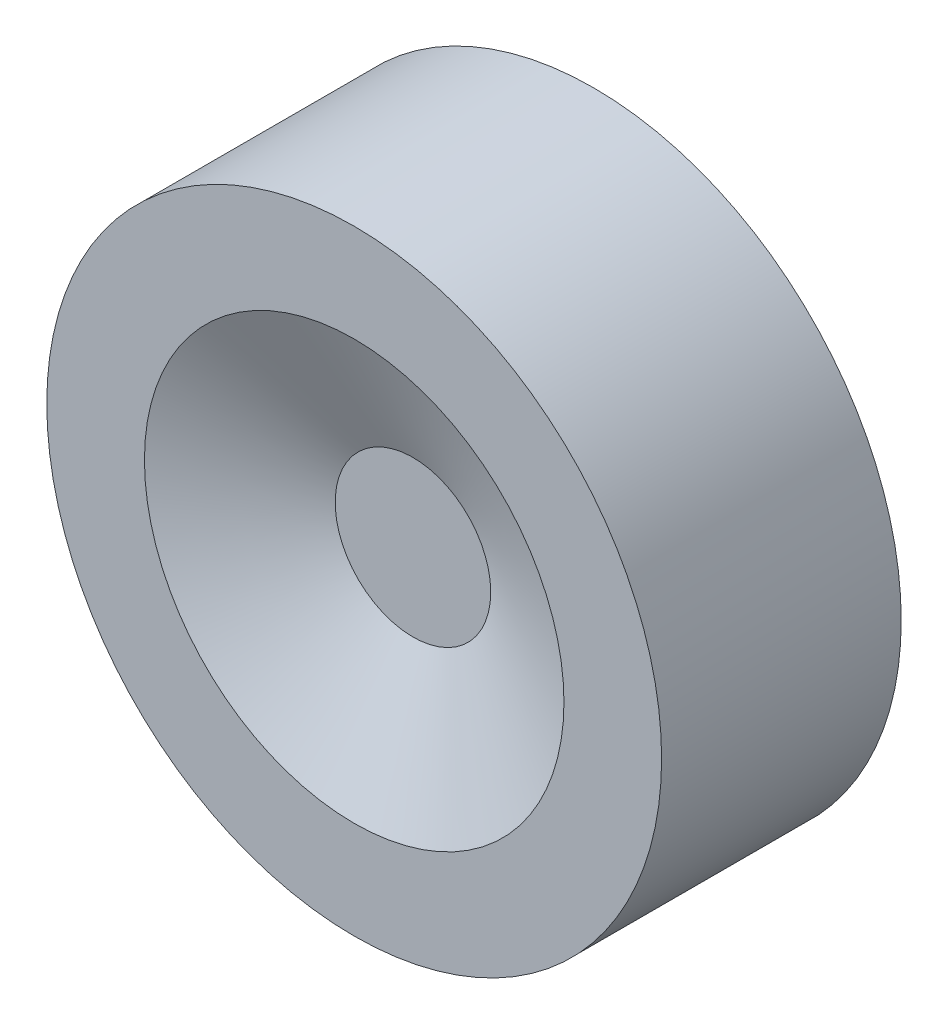
ISO-10303-21;
HEADER;
FILE_DESCRIPTION(('STEP AP214'),'2;1');
FILE_NAME('part.step','',(''),(''),'','','');
FILE_SCHEMA(('AUTOMOTIVE_DESIGN { 1 0 10303 214 1 1 1 1 }'));
ENDSEC;
DATA;
#1=APPLICATION_CONTEXT('core data for automotive mechanical design processes');
#2=APPLICATION_PROTOCOL_DEFINITION('international standard','automotive_design',2000,#1);
#3=PRODUCT_CONTEXT('',#1,'mechanical');
#4=PRODUCT('Part','Part','',(#3));
#5=PRODUCT_RELATED_PRODUCT_CATEGORY('part','',(#4));
#6=PRODUCT_DEFINITION_FORMATION('','',#4);
#7=PRODUCT_DEFINITION_CONTEXT('part definition',#1,'design');
#8=PRODUCT_DEFINITION('design','',#6,#7);
#9=PRODUCT_DEFINITION_SHAPE('','',#8);
#10=(LENGTH_UNIT() NAMED_UNIT(*) SI_UNIT(.MILLI.,.METRE.));
#11=(NAMED_UNIT(*) PLANE_ANGLE_UNIT() SI_UNIT($,.RADIAN.));
#12=(NAMED_UNIT(*) SI_UNIT($,.STERADIAN.) SOLID_ANGLE_UNIT());
#13=UNCERTAINTY_MEASURE_WITH_UNIT(LENGTH_MEASURE(1.E-05),#10,'distance_accuracy_value','');
#14=(GEOMETRIC_REPRESENTATION_CONTEXT(3) GLOBAL_UNCERTAINTY_ASSIGNED_CONTEXT((#13)) GLOBAL_UNIT_ASSIGNED_CONTEXT((#10,
#11,#12)) REPRESENTATION_CONTEXT('',''));
#15=CARTESIAN_POINT('',(0.,0.,0.));
#16=DIRECTION('',(0.,0.,1.));
#17=DIRECTION('',(1.,0.,0.));
#18=AXIS2_PLACEMENT_3D('',#15,#16,#17);
#19=CARTESIAN_POINT('',(0.,0.,26.5));
#20=DIRECTION('',(0.,0.,-1.));
#21=DIRECTION('',(-1.,0.,0.));
#22=AXIS2_PLACEMENT_3D('',#19,#20,#21);
#23=CYLINDRICAL_SURFACE('',#22,33.9999999999989);
#24=CARTESIAN_POINT('',(0.,0.,26.5));
#25=DIRECTION('',(0.,0.,1.));
#26=DIRECTION('',(1.,0.,0.));
#27=AXIS2_PLACEMENT_3D('',#24,#25,#26);
#28=CIRCLE('',#27,33.9999999999989);
#29=CARTESIAN_POINT('',(33.9999999999989,0.,26.5));
#30=VERTEX_POINT('',#29);
#31=EDGE_CURVE('E42',#30,#30,#28,.T.);
#32=ORIENTED_EDGE('',*,*,#31,.F.);
#33=EDGE_LOOP('',(#32));
#34=FACE_BOUND('',#33,.T.);
#35=CARTESIAN_POINT('',(0.,0.,0.));
#36=DIRECTION('',(0.,0.,1.));
#37=DIRECTION('',(1.,0.,0.));
#38=AXIS2_PLACEMENT_3D('',#35,#36,#37);
#39=CIRCLE('',#38,33.9999999999989);
#40=CARTESIAN_POINT('',(33.9999999999989,0.,0.));
#41=VERTEX_POINT('',#40);
#42=EDGE_CURVE('E38',#41,#41,#39,.T.);
#43=ORIENTED_EDGE('',*,*,#42,.T.);
#44=EDGE_LOOP('',(#43));
#45=FACE_BOUND('',#44,.T.);
#46=ADVANCED_FACE('F35',(#34,#45),#23,.T.);
#47=CARTESIAN_POINT('',(0.,0.,26.5));
#48=DIRECTION('',(0.,0.,1.));
#49=DIRECTION('',(1.,0.,0.));
#50=AXIS2_PLACEMENT_3D('',#47,#48,#49);
#51=PLANE('',#50);
#52=CARTESIAN_POINT('',(0.,0.,26.5));
#53=DIRECTION('',(0.,0.,1.));
#54=DIRECTION('',(1.,0.,0.));
#55=AXIS2_PLACEMENT_3D('',#52,#53,#54);
#56=CIRCLE('',#55,23.1999999999989);
#57=CARTESIAN_POINT('',(23.1999999999989,0.,26.5));
#58=VERTEX_POINT('',#57);
#59=EDGE_CURVE('E50',#58,#58,#56,.T.);
#60=ORIENTED_EDGE('',*,*,#59,.F.);
#61=EDGE_LOOP('',(#60));
#62=FACE_BOUND('',#61,.T.);
#63=ORIENTED_EDGE('',*,*,#31,.T.);
#64=EDGE_LOOP('',(#63));
#65=FACE_BOUND('',#64,.T.);
#66=ADVANCED_FACE('F64',(#62,#65),#51,.T.);
#67=CARTESIAN_POINT('',(0.,0.,0.));
#68=DIRECTION('',(0.,0.,1.));
#69=DIRECTION('',(1.,0.,0.));
#70=AXIS2_PLACEMENT_3D('',#67,#68,#69);
#71=PLANE('',#70);
#72=CARTESIAN_POINT('',(0.,0.,0.));
#73=DIRECTION('',(0.,0.,-1.));
#74=DIRECTION('',(-1.,0.,0.));
#75=AXIS2_PLACEMENT_3D('',#72,#73,#74);
#76=CIRCLE('',#75,5.75);
#77=CARTESIAN_POINT('',(-5.75,0.,0.));
#78=VERTEX_POINT('',#77);
#79=EDGE_CURVE('E10',#78,#78,#76,.T.);
#80=ORIENTED_EDGE('',*,*,#79,.F.);
#81=EDGE_LOOP('',(#80));
#82=FACE_BOUND('',#81,.T.);
#83=ORIENTED_EDGE('',*,*,#42,.F.);
#84=EDGE_LOOP('',(#83));
#85=FACE_BOUND('',#84,.T.);
#86=ADVANCED_FACE('F61',(#82,#85),#71,.F.);
#87=CARTESIAN_POINT('',(0.,0.,26.5));
#88=DIRECTION('',(0.,0.,1.));
#89=DIRECTION('',(1.,0.,0.));
#90=AXIS2_PLACEMENT_3D('',#87,#88,#89);
#91=CONICAL_SURFACE('',#90,23.1999999999989,1.15191730631626);
#92=CARTESIAN_POINT('',(0.,0.,20.));
#93=DIRECTION('',(0.,0.,1.));
#94=DIRECTION('',(1.,0.,0.));
#95=AXIS2_PLACEMENT_3D('',#92,#93,#94);
#96=CIRCLE('',#95,8.60076096962147);
#97=CARTESIAN_POINT('',(8.60076096962147,0.,20.));
#98=VERTEX_POINT('',#97);
#99=EDGE_CURVE('E53',#98,#98,#96,.T.);
#100=ORIENTED_EDGE('',*,*,#99,.F.);
#101=EDGE_LOOP('',(#100));
#102=FACE_BOUND('',#101,.T.);
#103=ORIENTED_EDGE('',*,*,#59,.T.);
#104=EDGE_LOOP('',(#103));
#105=FACE_BOUND('',#104,.T.);
#106=ADVANCED_FACE('F63',(#102,#105),#91,.F.);
#107=CARTESIAN_POINT('',(0.,0.,20.));
#108=DIRECTION('',(0.,0.,1.));
#109=DIRECTION('',(1.,0.,0.));
#110=AXIS2_PLACEMENT_3D('',#107,#108,#109);
#111=PLANE('',#110);
#112=ORIENTED_EDGE('',*,*,#99,.T.);
#113=EDGE_LOOP('',(#112));
#114=FACE_BOUND('',#113,.T.);
#115=ADVANCED_FACE('F70',(#114),#111,.T.);
#116=CARTESIAN_POINT('',(0.,0.,-5.));
#117=DIRECTION('',(0.,0.,1.));
#118=DIRECTION('',(1.,0.,0.));
#119=AXIS2_PLACEMENT_3D('',#116,#117,#118);
#120=CYLINDRICAL_SURFACE('',#119,5.75);
#121=CARTESIAN_POINT('',(0.,0.,-5.));
#122=DIRECTION('',(0.,0.,-1.));
#123=DIRECTION('',(-1.,0.,0.));
#124=AXIS2_PLACEMENT_3D('',#121,#122,#123);
#125=CIRCLE('',#124,5.75);
#126=CARTESIAN_POINT('',(-5.75,0.,-5.));
#127=VERTEX_POINT('',#126);
#128=EDGE_CURVE('E49',#127,#127,#125,.T.);
#129=ORIENTED_EDGE('',*,*,#128,.F.);
#130=EDGE_LOOP('',(#129));
#131=FACE_BOUND('',#130,.T.);
#132=ORIENTED_EDGE('',*,*,#79,.T.);
#133=EDGE_LOOP('',(#132));
#134=FACE_BOUND('',#133,.T.);
#135=ADVANCED_FACE('F100',(#131,#134),#120,.T.);
#136=CARTESIAN_POINT('',(0.,0.,-5.));
#137=DIRECTION('',(0.,0.,-1.));
#138=DIRECTION('',(-1.,0.,0.));
#139=AXIS2_PLACEMENT_3D('',#136,#137,#138);
#140=PLANE('',#139);
#141=ORIENTED_EDGE('',*,*,#128,.T.);
#142=EDGE_LOOP('',(#141));
#143=FACE_BOUND('',#142,.T.);
#144=ADVANCED_FACE('F113',(#143),#140,.T.);
#145=CLOSED_SHELL('',(#46,#66,#86,#106,#115,#135,#144));
#146=MANIFOLD_SOLID_BREP('B2',#145);
#147=ADVANCED_BREP_SHAPE_REPRESENTATION('',(#18,#146),#14);
#148=SHAPE_DEFINITION_REPRESENTATION(#9,#147);
ENDSEC;
END-ISO-10303-21;
